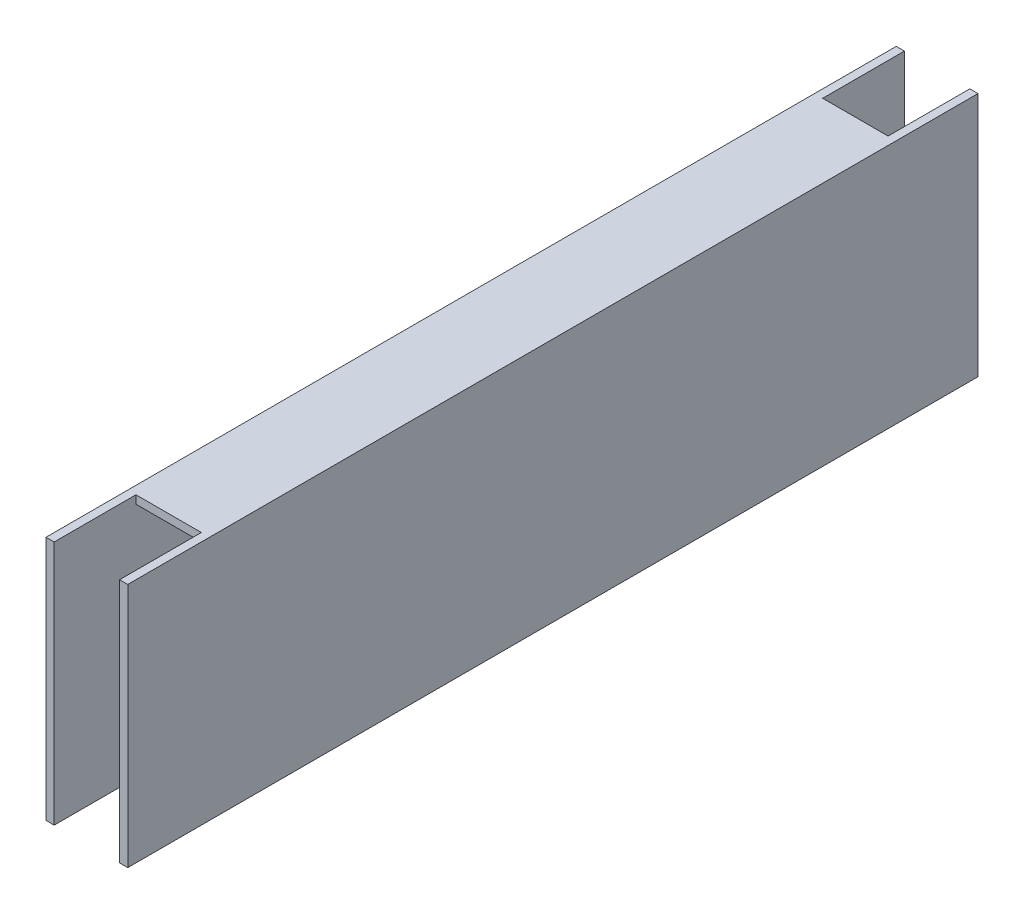
ISO-10303-21;
HEADER;
FILE_DESCRIPTION(('STEP AP214'),'2;1');
FILE_NAME('part.step','',(''),(''),'','','');
FILE_SCHEMA(('AUTOMOTIVE_DESIGN { 1 0 10303 214 1 1 1 1 }'));
ENDSEC;
DATA;
#1=APPLICATION_CONTEXT('core data for automotive mechanical design processes');
#2=APPLICATION_PROTOCOL_DEFINITION('international standard','automotive_design',2000,#1);
#3=PRODUCT_CONTEXT('',#1,'mechanical');
#4=PRODUCT('Part','Part','',(#3));
#5=PRODUCT_RELATED_PRODUCT_CATEGORY('part','',(#4));
#6=PRODUCT_DEFINITION_FORMATION('','',#4);
#7=PRODUCT_DEFINITION_CONTEXT('part definition',#1,'design');
#8=PRODUCT_DEFINITION('design','',#6,#7);
#9=PRODUCT_DEFINITION_SHAPE('','',#8);
#10=(LENGTH_UNIT() NAMED_UNIT(*) SI_UNIT(.MILLI.,.METRE.));
#11=(NAMED_UNIT(*) PLANE_ANGLE_UNIT() SI_UNIT($,.RADIAN.));
#12=(NAMED_UNIT(*) SI_UNIT($,.STERADIAN.) SOLID_ANGLE_UNIT());
#13=UNCERTAINTY_MEASURE_WITH_UNIT(LENGTH_MEASURE(1.E-05),#10,'distance_accuracy_value','');
#14=(GEOMETRIC_REPRESENTATION_CONTEXT(3) GLOBAL_UNCERTAINTY_ASSIGNED_CONTEXT((#13)) GLOBAL_UNIT_ASSIGNED_CONTEXT((#10,
#11,#12)) REPRESENTATION_CONTEXT('',''));
#15=CARTESIAN_POINT('',(0.,0.,0.));
#16=DIRECTION('',(0.,0.,1.));
#17=DIRECTION('',(1.,0.,0.));
#18=AXIS2_PLACEMENT_3D('',#15,#16,#17);
#19=CARTESIAN_POINT('',(-25.,150.,-420.));
#20=DIRECTION('',(0.,0.,1.));
#21=DIRECTION('',(1.,0.,0.));
#22=AXIS2_PLACEMENT_3D('',#19,#20,#21);
#23=PLANE('',#22);
#24=DIRECTION('',(0.,-1.,0.));
#25=VECTOR('',#24,1.);
#26=CARTESIAN_POINT('',(-20.,150.,-420.));
#27=LINE('',#26,#25);
#28=CARTESIAN_POINT('',(-20.,150.,-420.));
#29=VERTEX_POINT('',#28);
#30=CARTESIAN_POINT('',(-20.,145.,-420.));
#31=VERTEX_POINT('',#30);
#32=EDGE_CURVE('E64',#29,#31,#27,.T.);
#33=ORIENTED_EDGE('',*,*,#32,.F.);
#34=DIRECTION('',(-1.,0.,0.));
#35=VECTOR('',#34,1.);
#36=CARTESIAN_POINT('',(-25.,150.,-420.));
#37=LINE('',#36,#35);
#38=CARTESIAN_POINT('',(20.,150.,-420.));
#39=VERTEX_POINT('',#38);
#40=EDGE_CURVE('E188',#39,#29,#37,.T.);
#41=ORIENTED_EDGE('',*,*,#40,.F.);
#42=DIRECTION('',(0.,1.,0.));
#43=VECTOR('',#42,1.);
#44=CARTESIAN_POINT('',(20.,0.,-420.));
#45=LINE('',#44,#43);
#46=CARTESIAN_POINT('',(20.,145.,-420.));
#47=VERTEX_POINT('',#46);
#48=EDGE_CURVE('E11',#47,#39,#45,.T.);
#49=ORIENTED_EDGE('',*,*,#48,.F.);
#50=DIRECTION('',(-1.,0.,0.));
#51=VECTOR('',#50,1.);
#52=CARTESIAN_POINT('',(20.,145.,-420.));
#53=LINE('',#52,#51);
#54=EDGE_CURVE('E276',#47,#31,#53,.T.);
#55=ORIENTED_EDGE('',*,*,#54,.T.);
#56=EDGE_LOOP('',(#33,#41,#49,#55));
#57=FACE_BOUND('',#56,.T.);
#58=ADVANCED_FACE('F45',(#57),#23,.F.);
#59=CARTESIAN_POINT('',(-20.,5.,-420.));
#60=VERTEX_POINT('',#59);
#61=CARTESIAN_POINT('',(-20.,0.,-420.));
#62=VERTEX_POINT('',#61);
#63=EDGE_CURVE('E351',#60,#62,#27,.T.);
#64=ORIENTED_EDGE('',*,*,#63,.F.);
#65=DIRECTION('',(1.,0.,0.));
#66=VECTOR('',#65,1.);
#67=CARTESIAN_POINT('',(-20.,5.,-420.));
#68=LINE('',#67,#66);
#69=CARTESIAN_POINT('',(20.,5.,-420.));
#70=VERTEX_POINT('',#69);
#71=EDGE_CURVE('E272',#60,#70,#68,.T.);
#72=ORIENTED_EDGE('',*,*,#71,.T.);
#73=CARTESIAN_POINT('',(20.,0.,-420.));
#74=VERTEX_POINT('',#73);
#75=EDGE_CURVE('E57',#74,#70,#45,.T.);
#76=ORIENTED_EDGE('',*,*,#75,.F.);
#77=DIRECTION('',(-1.,0.,0.));
#78=VECTOR('',#77,1.);
#79=CARTESIAN_POINT('',(-25.,0.,-420.));
#80=LINE('',#79,#78);
#81=EDGE_CURVE('E49',#74,#62,#80,.T.);
#82=ORIENTED_EDGE('',*,*,#81,.T.);
#83=EDGE_LOOP('',(#64,#72,#76,#82));
#84=FACE_BOUND('',#83,.T.);
#85=ADVANCED_FACE('F385',(#84),#23,.F.);
#86=CARTESIAN_POINT('',(-25.,150.,0.));
#87=DIRECTION('',(0.,0.,-1.));
#88=DIRECTION('',(-1.,0.,0.));
#89=AXIS2_PLACEMENT_3D('',#86,#87,#88);
#90=PLANE('',#89);
#91=DIRECTION('',(0.,1.,0.));
#92=VECTOR('',#91,1.);
#93=CARTESIAN_POINT('',(-20.,150.,0.));
#94=LINE('',#93,#92);
#95=CARTESIAN_POINT('',(-20.,0.,0.));
#96=VERTEX_POINT('',#95);
#97=CARTESIAN_POINT('',(-20.,5.,0.));
#98=VERTEX_POINT('',#97);
#99=EDGE_CURVE('E225',#96,#98,#94,.T.);
#100=ORIENTED_EDGE('',*,*,#99,.F.);
#101=DIRECTION('',(1.,0.,0.));
#102=VECTOR('',#101,1.);
#103=CARTESIAN_POINT('',(-25.,0.,0.));
#104=LINE('',#103,#102);
#105=CARTESIAN_POINT('',(20.,0.,0.));
#106=VERTEX_POINT('',#105);
#107=EDGE_CURVE('E314',#96,#106,#104,.T.);
#108=ORIENTED_EDGE('',*,*,#107,.T.);
#109=DIRECTION('',(0.,-1.,0.));
#110=VECTOR('',#109,1.);
#111=CARTESIAN_POINT('',(20.,0.,0.));
#112=LINE('',#111,#110);
#113=CARTESIAN_POINT('',(20.,5.,0.));
#114=VERTEX_POINT('',#113);
#115=EDGE_CURVE('E55',#114,#106,#112,.T.);
#116=ORIENTED_EDGE('',*,*,#115,.F.);
#117=DIRECTION('',(1.,0.,0.));
#118=VECTOR('',#117,1.);
#119=CARTESIAN_POINT('',(-20.,5.,0.));
#120=LINE('',#119,#118);
#121=EDGE_CURVE('E271',#98,#114,#120,.T.);
#122=ORIENTED_EDGE('',*,*,#121,.F.);
#123=EDGE_LOOP('',(#100,#108,#116,#122));
#124=FACE_BOUND('',#123,.T.);
#125=ADVANCED_FACE('F364',(#124),#90,.F.);
#126=CARTESIAN_POINT('',(-20.,145.,0.));
#127=VERTEX_POINT('',#126);
#128=CARTESIAN_POINT('',(-20.,150.,0.));
#129=VERTEX_POINT('',#128);
#130=EDGE_CURVE('E219',#127,#129,#94,.T.);
#131=ORIENTED_EDGE('',*,*,#130,.F.);
#132=DIRECTION('',(-1.,0.,0.));
#133=VECTOR('',#132,1.);
#134=CARTESIAN_POINT('',(20.,145.,0.));
#135=LINE('',#134,#133);
#136=CARTESIAN_POINT('',(20.,145.,0.));
#137=VERTEX_POINT('',#136);
#138=EDGE_CURVE('E277',#137,#127,#135,.T.);
#139=ORIENTED_EDGE('',*,*,#138,.F.);
#140=CARTESIAN_POINT('',(20.,150.,0.));
#141=VERTEX_POINT('',#140);
#142=EDGE_CURVE('E245',#141,#137,#112,.T.);
#143=ORIENTED_EDGE('',*,*,#142,.F.);
#144=DIRECTION('',(1.,0.,0.));
#145=VECTOR('',#144,1.);
#146=CARTESIAN_POINT('',(-25.,150.,0.));
#147=LINE('',#146,#145);
#148=EDGE_CURVE('E304',#129,#141,#147,.T.);
#149=ORIENTED_EDGE('',*,*,#148,.F.);
#150=EDGE_LOOP('',(#131,#139,#143,#149));
#151=FACE_BOUND('',#150,.T.);
#152=ADVANCED_FACE('F346',(#151),#90,.F.);
#153=CARTESIAN_POINT('',(-25.,150.,0.));
#154=DIRECTION('',(1.,0.,0.));
#155=DIRECTION('',(0.,0.,-1.));
#156=AXIS2_PLACEMENT_3D('',#153,#154,#155);
#157=PLANE('',#156);
#158=DIRECTION('',(0.,0.,1.));
#159=VECTOR('',#158,1.);
#160=CARTESIAN_POINT('',(-25.,0.,0.));
#161=LINE('',#160,#159);
#162=CARTESIAN_POINT('',(-25.,0.,-470.));
#163=VERTEX_POINT('',#162);
#164=CARTESIAN_POINT('',(-25.,0.,50.));
#165=VERTEX_POINT('',#164);
#166=EDGE_CURVE('E290',#163,#165,#161,.T.);
#167=ORIENTED_EDGE('',*,*,#166,.T.);
#168=DIRECTION('',(0.,-1.,0.));
#169=VECTOR('',#168,1.);
#170=CARTESIAN_POINT('',(-25.,0.,50.));
#171=LINE('',#170,#169);
#172=CARTESIAN_POINT('',(-25.,150.,50.));
#173=VERTEX_POINT('',#172);
#174=EDGE_CURVE('E229',#173,#165,#171,.T.);
#175=ORIENTED_EDGE('',*,*,#174,.F.);
#176=DIRECTION('',(0.,0.,1.));
#177=VECTOR('',#176,1.);
#178=CARTESIAN_POINT('',(-25.,150.,0.));
#179=LINE('',#178,#177);
#180=CARTESIAN_POINT('',(-25.,150.,-470.));
#181=VERTEX_POINT('',#180);
#182=EDGE_CURVE('E301',#181,#173,#179,.T.);
#183=ORIENTED_EDGE('',*,*,#182,.F.);
#184=DIRECTION('',(0.,1.,0.));
#185=VECTOR('',#184,1.);
#186=CARTESIAN_POINT('',(-25.,0.,-470.));
#187=LINE('',#186,#185);
#188=EDGE_CURVE('E182',#163,#181,#187,.T.);
#189=ORIENTED_EDGE('',*,*,#188,.F.);
#190=EDGE_LOOP('',(#167,#175,#183,#189));
#191=FACE_BOUND('',#190,.T.);
#192=ADVANCED_FACE('F47',(#191),#157,.F.);
#193=CARTESIAN_POINT('',(25.,150.,-420.));
#194=DIRECTION('',(-1.,0.,0.));
#195=DIRECTION('',(0.,0.,1.));
#196=AXIS2_PLACEMENT_3D('',#193,#194,#195);
#197=PLANE('',#196);
#198=DIRECTION('',(0.,0.,-1.));
#199=VECTOR('',#198,1.);
#200=CARTESIAN_POINT('',(25.,0.,-420.));
#201=LINE('',#200,#199);
#202=CARTESIAN_POINT('',(25.,0.,50.));
#203=VERTEX_POINT('',#202);
#204=CARTESIAN_POINT('',(25.,0.,-470.));
#205=VERTEX_POINT('',#204);
#206=EDGE_CURVE('E316',#203,#205,#201,.T.);
#207=ORIENTED_EDGE('',*,*,#206,.T.);
#208=DIRECTION('',(0.,-1.,0.));
#209=VECTOR('',#208,1.);
#210=CARTESIAN_POINT('',(25.,150.,-470.));
#211=LINE('',#210,#209);
#212=CARTESIAN_POINT('',(25.,150.,-470.));
#213=VERTEX_POINT('',#212);
#214=EDGE_CURVE('E205',#213,#205,#211,.T.);
#215=ORIENTED_EDGE('',*,*,#214,.F.);
#216=DIRECTION('',(0.,0.,-1.));
#217=VECTOR('',#216,1.);
#218=CARTESIAN_POINT('',(25.,150.,-420.));
#219=LINE('',#218,#217);
#220=CARTESIAN_POINT('',(25.,150.,50.));
#221=VERTEX_POINT('',#220);
#222=EDGE_CURVE('E307',#221,#213,#219,.T.);
#223=ORIENTED_EDGE('',*,*,#222,.F.);
#224=DIRECTION('',(0.,1.,0.));
#225=VECTOR('',#224,1.);
#226=CARTESIAN_POINT('',(25.,150.,50.));
#227=LINE('',#226,#225);
#228=EDGE_CURVE('E250',#203,#221,#227,.T.);
#229=ORIENTED_EDGE('',*,*,#228,.F.);
#230=EDGE_LOOP('',(#207,#215,#223,#229));
#231=FACE_BOUND('',#230,.T.);
#232=ADVANCED_FACE('F373',(#231),#197,.F.);
#233=CARTESIAN_POINT('',(0.,150.,0.));
#234=DIRECTION('',(0.,-1.,0.));
#235=DIRECTION('',(0.,0.,-1.));
#236=AXIS2_PLACEMENT_3D('',#233,#234,#235);
#237=PLANE('',#236);
#238=ORIENTED_EDGE('',*,*,#182,.T.);
#239=DIRECTION('',(-1.,0.,0.));
#240=VECTOR('',#239,1.);
#241=CARTESIAN_POINT('',(-25.,150.,50.));
#242=LINE('',#241,#240);
#243=CARTESIAN_POINT('',(-20.,150.,50.));
#244=VERTEX_POINT('',#243);
#245=EDGE_CURVE('E224',#244,#173,#242,.T.);
#246=ORIENTED_EDGE('',*,*,#245,.F.);
#247=DIRECTION('',(0.,0.,-1.));
#248=VECTOR('',#247,1.);
#249=CARTESIAN_POINT('',(-20.,150.,50.));
#250=LINE('',#249,#248);
#251=EDGE_CURVE('E241',#244,#129,#250,.T.);
#252=ORIENTED_EDGE('',*,*,#251,.T.);
#253=ORIENTED_EDGE('',*,*,#148,.T.);
#254=DIRECTION('',(0.,0.,-1.));
#255=VECTOR('',#254,1.);
#256=CARTESIAN_POINT('',(20.,150.,50.));
#257=LINE('',#256,#255);
#258=CARTESIAN_POINT('',(20.,150.,50.));
#259=VERTEX_POINT('',#258);
#260=EDGE_CURVE('E267',#259,#141,#257,.T.);
#261=ORIENTED_EDGE('',*,*,#260,.F.);
#262=DIRECTION('',(-1.,0.,0.));
#263=VECTOR('',#262,1.);
#264=CARTESIAN_POINT('',(20.,150.,50.));
#265=LINE('',#264,#263);
#266=EDGE_CURVE('E254',#221,#259,#265,.T.);
#267=ORIENTED_EDGE('',*,*,#266,.F.);
#268=ORIENTED_EDGE('',*,*,#222,.T.);
#269=DIRECTION('',(1.,0.,0.));
#270=VECTOR('',#269,1.);
#271=CARTESIAN_POINT('',(20.,150.,-470.));
#272=LINE('',#271,#270);
#273=CARTESIAN_POINT('',(20.,150.,-470.));
#274=VERTEX_POINT('',#273);
#275=EDGE_CURVE('E201',#274,#213,#272,.T.);
#276=ORIENTED_EDGE('',*,*,#275,.F.);
#277=DIRECTION('',(0.,0.,1.));
#278=VECTOR('',#277,1.);
#279=CARTESIAN_POINT('',(20.,150.,-470.));
#280=LINE('',#279,#278);
#281=EDGE_CURVE('E216',#274,#39,#280,.T.);
#282=ORIENTED_EDGE('',*,*,#281,.T.);
#283=ORIENTED_EDGE('',*,*,#40,.T.);
#284=DIRECTION('',(0.,0.,1.));
#285=VECTOR('',#284,1.);
#286=CARTESIAN_POINT('',(-20.,150.,-470.));
#287=LINE('',#286,#285);
#288=CARTESIAN_POINT('',(-20.,150.,-470.));
#289=VERTEX_POINT('',#288);
#290=EDGE_CURVE('E168',#289,#29,#287,.T.);
#291=ORIENTED_EDGE('',*,*,#290,.F.);
#292=DIRECTION('',(1.,0.,0.));
#293=VECTOR('',#292,1.);
#294=CARTESIAN_POINT('',(-25.,150.,-470.));
#295=LINE('',#294,#293);
#296=EDGE_CURVE('E176',#181,#289,#295,.T.);
#297=ORIENTED_EDGE('',*,*,#296,.F.);
#298=EDGE_LOOP('',(#238,#246,#252,#253,#261,#267,#268,#276,#282,#283,#291,#297));
#299=FACE_BOUND('',#298,.T.);
#300=ADVANCED_FACE('F186',(#299),#237,.F.);
#301=CARTESIAN_POINT('',(0.,0.,0.));
#302=DIRECTION('',(0.,-1.,0.));
#303=DIRECTION('',(0.,0.,-1.));
#304=AXIS2_PLACEMENT_3D('',#301,#302,#303);
#305=PLANE('',#304);
#306=ORIENTED_EDGE('',*,*,#166,.F.);
#307=DIRECTION('',(-1.,0.,0.));
#308=VECTOR('',#307,1.);
#309=CARTESIAN_POINT('',(-20.,0.,-470.));
#310=LINE('',#309,#308);
#311=CARTESIAN_POINT('',(-20.,0.,-470.));
#312=VERTEX_POINT('',#311);
#313=EDGE_CURVE('E175',#312,#163,#310,.T.);
#314=ORIENTED_EDGE('',*,*,#313,.F.);
#315=DIRECTION('',(0.,0.,1.));
#316=VECTOR('',#315,1.);
#317=CARTESIAN_POINT('',(-20.,0.,-470.));
#318=LINE('',#317,#316);
#319=EDGE_CURVE('E170',#312,#62,#318,.T.);
#320=ORIENTED_EDGE('',*,*,#319,.T.);
#321=ORIENTED_EDGE('',*,*,#81,.F.);
#322=DIRECTION('',(0.,0.,1.));
#323=VECTOR('',#322,1.);
#324=CARTESIAN_POINT('',(20.,0.,-470.));
#325=LINE('',#324,#323);
#326=CARTESIAN_POINT('',(20.,0.,-470.));
#327=VERTEX_POINT('',#326);
#328=EDGE_CURVE('E211',#327,#74,#325,.T.);
#329=ORIENTED_EDGE('',*,*,#328,.F.);
#330=DIRECTION('',(-1.,0.,0.));
#331=VECTOR('',#330,1.);
#332=CARTESIAN_POINT('',(25.,0.,-470.));
#333=LINE('',#332,#331);
#334=EDGE_CURVE('E209',#205,#327,#333,.T.);
#335=ORIENTED_EDGE('',*,*,#334,.F.);
#336=ORIENTED_EDGE('',*,*,#206,.F.);
#337=DIRECTION('',(1.,0.,0.));
#338=VECTOR('',#337,1.);
#339=CARTESIAN_POINT('',(25.,0.,50.));
#340=LINE('',#339,#338);
#341=CARTESIAN_POINT('',(20.,0.,50.));
#342=VERTEX_POINT('',#341);
#343=EDGE_CURVE('E246',#342,#203,#340,.T.);
#344=ORIENTED_EDGE('',*,*,#343,.F.);
#345=DIRECTION('',(0.,0.,-1.));
#346=VECTOR('',#345,1.);
#347=CARTESIAN_POINT('',(20.,0.,50.));
#348=LINE('',#347,#346);
#349=EDGE_CURVE('E260',#342,#106,#348,.T.);
#350=ORIENTED_EDGE('',*,*,#349,.T.);
#351=ORIENTED_EDGE('',*,*,#107,.F.);
#352=DIRECTION('',(0.,0.,-1.));
#353=VECTOR('',#352,1.);
#354=CARTESIAN_POINT('',(-20.,0.,50.));
#355=LINE('',#354,#353);
#356=CARTESIAN_POINT('',(-20.,0.,50.));
#357=VERTEX_POINT('',#356);
#358=EDGE_CURVE('E236',#357,#96,#355,.T.);
#359=ORIENTED_EDGE('',*,*,#358,.F.);
#360=DIRECTION('',(1.,0.,0.));
#361=VECTOR('',#360,1.);
#362=CARTESIAN_POINT('',(-20.,0.,50.));
#363=LINE('',#362,#361);
#364=EDGE_CURVE('E233',#165,#357,#363,.T.);
#365=ORIENTED_EDGE('',*,*,#364,.F.);
#366=EDGE_LOOP('',(#306,#314,#320,#321,#329,#335,#336,#344,#350,#351,#359,#365));
#367=FACE_BOUND('',#366,.T.);
#368=ADVANCED_FACE('F333',(#367),#305,.T.);
#369=CARTESIAN_POINT('',(20.,145.,-420.));
#370=DIRECTION('',(0.,1.,0.));
#371=DIRECTION('',(0.,0.,1.));
#372=AXIS2_PLACEMENT_3D('',#369,#370,#371);
#373=PLANE('',#372);
#374=ORIENTED_EDGE('',*,*,#138,.T.);
#375=DIRECTION('',(0.,0.,1.));
#376=VECTOR('',#375,1.);
#377=CARTESIAN_POINT('',(-20.,145.,-420.));
#378=LINE('',#377,#376);
#379=EDGE_CURVE('E287',#31,#127,#378,.T.);
#380=ORIENTED_EDGE('',*,*,#379,.F.);
#381=ORIENTED_EDGE('',*,*,#54,.F.);
#382=DIRECTION('',(0.,0.,1.));
#383=VECTOR('',#382,1.);
#384=CARTESIAN_POINT('',(20.,145.,-420.));
#385=LINE('',#384,#383);
#386=EDGE_CURVE('E291',#47,#137,#385,.T.);
#387=ORIENTED_EDGE('',*,*,#386,.T.);
#388=EDGE_LOOP('',(#374,#380,#381,#387));
#389=FACE_BOUND('',#388,.T.);
#390=ADVANCED_FACE('F348',(#389),#373,.F.);
#391=CARTESIAN_POINT('',(20.,5.,-420.));
#392=DIRECTION('',(1.,0.,0.));
#393=DIRECTION('',(0.,0.,-1.));
#394=AXIS2_PLACEMENT_3D('',#391,#392,#393);
#395=PLANE('',#394);
#396=DIRECTION('',(0.,0.,1.));
#397=VECTOR('',#396,1.);
#398=CARTESIAN_POINT('',(20.,5.,-420.));
#399=LINE('',#398,#397);
#400=EDGE_CURVE('E294',#70,#114,#399,.T.);
#401=ORIENTED_EDGE('',*,*,#400,.T.);
#402=ORIENTED_EDGE('',*,*,#115,.T.);
#403=ORIENTED_EDGE('',*,*,#349,.F.);
#404=DIRECTION('',(0.,-1.,0.));
#405=VECTOR('',#404,1.);
#406=CARTESIAN_POINT('',(20.,0.,50.));
#407=LINE('',#406,#405);
#408=EDGE_CURVE('E257',#259,#342,#407,.T.);
#409=ORIENTED_EDGE('',*,*,#408,.F.);
#410=ORIENTED_EDGE('',*,*,#260,.T.);
#411=ORIENTED_EDGE('',*,*,#142,.T.);
#412=ORIENTED_EDGE('',*,*,#386,.F.);
#413=ORIENTED_EDGE('',*,*,#48,.T.);
#414=ORIENTED_EDGE('',*,*,#281,.F.);
#415=DIRECTION('',(0.,1.,0.));
#416=VECTOR('',#415,1.);
#417=CARTESIAN_POINT('',(20.,0.,-470.));
#418=LINE('',#417,#416);
#419=EDGE_CURVE('E194',#327,#274,#418,.T.);
#420=ORIENTED_EDGE('',*,*,#419,.F.);
#421=ORIENTED_EDGE('',*,*,#328,.T.);
#422=ORIENTED_EDGE('',*,*,#75,.T.);
#423=EDGE_LOOP('',(#401,#402,#403,#409,#410,#411,#412,#413,#414,#420,#421,#422));
#424=FACE_BOUND('',#423,.T.);
#425=ADVANCED_FACE('F326',(#424),#395,.F.);
#426=CARTESIAN_POINT('',(-20.,5.,-420.));
#427=DIRECTION('',(0.,-1.,0.));
#428=DIRECTION('',(0.,0.,-1.));
#429=AXIS2_PLACEMENT_3D('',#426,#427,#428);
#430=PLANE('',#429);
#431=ORIENTED_EDGE('',*,*,#121,.T.);
#432=ORIENTED_EDGE('',*,*,#400,.F.);
#433=ORIENTED_EDGE('',*,*,#71,.F.);
#434=DIRECTION('',(0.,0.,1.));
#435=VECTOR('',#434,1.);
#436=CARTESIAN_POINT('',(-20.,5.,-420.));
#437=LINE('',#436,#435);
#438=EDGE_CURVE('E280',#60,#98,#437,.T.);
#439=ORIENTED_EDGE('',*,*,#438,.T.);
#440=EDGE_LOOP('',(#431,#432,#433,#439));
#441=FACE_BOUND('',#440,.T.);
#442=ADVANCED_FACE('F366',(#441),#430,.F.);
#443=CARTESIAN_POINT('',(-20.,75.,-420.));
#444=DIRECTION('',(-1.,0.,0.));
#445=DIRECTION('',(0.,0.,1.));
#446=AXIS2_PLACEMENT_3D('',#443,#444,#445);
#447=PLANE('',#446);
#448=ORIENTED_EDGE('',*,*,#379,.T.);
#449=ORIENTED_EDGE('',*,*,#130,.T.);
#450=ORIENTED_EDGE('',*,*,#251,.F.);
#451=DIRECTION('',(0.,1.,0.));
#452=VECTOR('',#451,1.);
#453=CARTESIAN_POINT('',(-20.,150.,50.));
#454=LINE('',#453,#452);
#455=EDGE_CURVE('E220',#357,#244,#454,.T.);
#456=ORIENTED_EDGE('',*,*,#455,.F.);
#457=ORIENTED_EDGE('',*,*,#358,.T.);
#458=ORIENTED_EDGE('',*,*,#99,.T.);
#459=ORIENTED_EDGE('',*,*,#438,.F.);
#460=ORIENTED_EDGE('',*,*,#63,.T.);
#461=ORIENTED_EDGE('',*,*,#319,.F.);
#462=DIRECTION('',(0.,-1.,0.));
#463=VECTOR('',#462,1.);
#464=CARTESIAN_POINT('',(-20.,150.,-470.));
#465=LINE('',#464,#463);
#466=EDGE_CURVE('E163',#289,#312,#465,.T.);
#467=ORIENTED_EDGE('',*,*,#466,.F.);
#468=ORIENTED_EDGE('',*,*,#290,.T.);
#469=ORIENTED_EDGE('',*,*,#32,.T.);
#470=EDGE_LOOP('',(#448,#449,#450,#456,#457,#458,#459,#460,#461,#467,#468,#469));
#471=FACE_BOUND('',#470,.T.);
#472=ADVANCED_FACE('F166',(#471),#447,.F.);
#473=CARTESIAN_POINT('',(0.,0.,50.));
#474=DIRECTION('',(0.,0.,-1.));
#475=DIRECTION('',(-1.,0.,0.));
#476=AXIS2_PLACEMENT_3D('',#473,#474,#475);
#477=PLANE('',#476);
#478=ORIENTED_EDGE('',*,*,#343,.T.);
#479=ORIENTED_EDGE('',*,*,#228,.T.);
#480=ORIENTED_EDGE('',*,*,#266,.T.);
#481=ORIENTED_EDGE('',*,*,#408,.T.);
#482=EDGE_LOOP('',(#478,#479,#480,#481));
#483=FACE_BOUND('',#482,.T.);
#484=ADVANCED_FACE('F337',(#483),#477,.F.);
#485=CARTESIAN_POINT('',(0.,0.,50.));
#486=DIRECTION('',(0.,0.,-1.));
#487=DIRECTION('',(-1.,0.,0.));
#488=AXIS2_PLACEMENT_3D('',#485,#486,#487);
#489=PLANE('',#488);
#490=ORIENTED_EDGE('',*,*,#455,.T.);
#491=ORIENTED_EDGE('',*,*,#245,.T.);
#492=ORIENTED_EDGE('',*,*,#174,.T.);
#493=ORIENTED_EDGE('',*,*,#364,.T.);
#494=EDGE_LOOP('',(#490,#491,#492,#493));
#495=FACE_BOUND('',#494,.T.);
#496=ADVANCED_FACE('F360',(#495),#489,.F.);
#497=CARTESIAN_POINT('',(0.,0.,-470.));
#498=DIRECTION('',(0.,0.,-1.));
#499=DIRECTION('',(-1.,0.,0.));
#500=AXIS2_PLACEMENT_3D('',#497,#498,#499);
#501=PLANE('',#500);
#502=ORIENTED_EDGE('',*,*,#419,.T.);
#503=ORIENTED_EDGE('',*,*,#275,.T.);
#504=ORIENTED_EDGE('',*,*,#214,.T.);
#505=ORIENTED_EDGE('',*,*,#334,.T.);
#506=EDGE_LOOP('',(#502,#503,#504,#505));
#507=FACE_BOUND('',#506,.T.);
#508=ADVANCED_FACE('F372',(#507),#501,.T.);
#509=CARTESIAN_POINT('',(0.,0.,-470.));
#510=DIRECTION('',(0.,0.,-1.));
#511=DIRECTION('',(-1.,0.,0.));
#512=AXIS2_PLACEMENT_3D('',#509,#510,#511);
#513=PLANE('',#512);
#514=ORIENTED_EDGE('',*,*,#296,.T.);
#515=ORIENTED_EDGE('',*,*,#466,.T.);
#516=ORIENTED_EDGE('',*,*,#313,.T.);
#517=ORIENTED_EDGE('',*,*,#188,.T.);
#518=EDGE_LOOP('',(#514,#515,#516,#517));
#519=FACE_BOUND('',#518,.T.);
#520=ADVANCED_FACE('F180',(#519),#513,.T.);
#521=CLOSED_SHELL('',(#58,#85,#125,#152,#192,#232,#300,#368,#390,#425,#442,#472,#484,#496,#508,#520));
#522=MANIFOLD_SOLID_BREP('B2',#521);
#523=ADVANCED_BREP_SHAPE_REPRESENTATION('',(#18,#522),#14);
#524=SHAPE_DEFINITION_REPRESENTATION(#9,#523);
ENDSEC;
END-ISO-10303-21;
